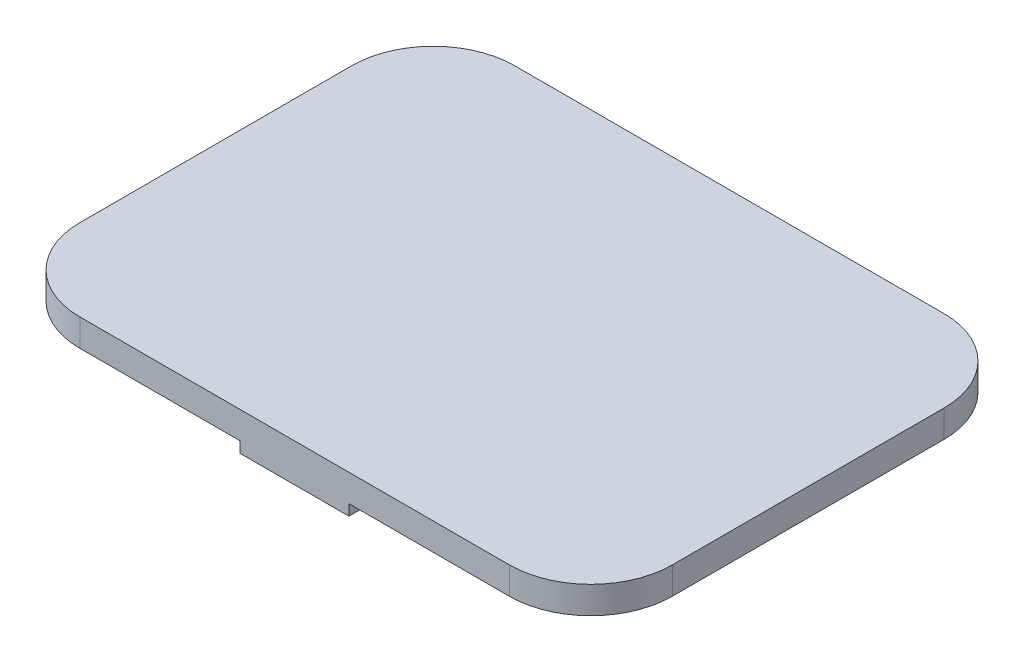
ISO-10303-21;
HEADER;
FILE_DESCRIPTION(('STEP AP214'),'2;1');
FILE_NAME('part.step','',(''),(''),'','','');
FILE_SCHEMA(('AUTOMOTIVE_DESIGN { 1 0 10303 214 1 1 1 1 }'));
ENDSEC;
DATA;
#1=APPLICATION_CONTEXT('core data for automotive mechanical design processes');
#2=APPLICATION_PROTOCOL_DEFINITION('international standard','automotive_design',2000,#1);
#3=PRODUCT_CONTEXT('',#1,'mechanical');
#4=PRODUCT('Part','Part','',(#3));
#5=PRODUCT_RELATED_PRODUCT_CATEGORY('part','',(#4));
#6=PRODUCT_DEFINITION_FORMATION('','',#4);
#7=PRODUCT_DEFINITION_CONTEXT('part definition',#1,'design');
#8=PRODUCT_DEFINITION('design','',#6,#7);
#9=PRODUCT_DEFINITION_SHAPE('','',#8);
#10=(LENGTH_UNIT() NAMED_UNIT(*) SI_UNIT(.MILLI.,.METRE.));
#11=(NAMED_UNIT(*) PLANE_ANGLE_UNIT() SI_UNIT($,.RADIAN.));
#12=(NAMED_UNIT(*) SI_UNIT($,.STERADIAN.) SOLID_ANGLE_UNIT());
#13=UNCERTAINTY_MEASURE_WITH_UNIT(LENGTH_MEASURE(1.E-05),#10,'distance_accuracy_value','');
#14=(GEOMETRIC_REPRESENTATION_CONTEXT(3) GLOBAL_UNCERTAINTY_ASSIGNED_CONTEXT((#13)) GLOBAL_UNIT_ASSIGNED_CONTEXT((#10,
#11,#12)) REPRESENTATION_CONTEXT('',''));
#15=CARTESIAN_POINT('',(0.,0.,0.));
#16=DIRECTION('',(0.,0.,1.));
#17=DIRECTION('',(1.,0.,0.));
#18=AXIS2_PLACEMENT_3D('',#15,#16,#17);
#19=CARTESIAN_POINT('',(0.,0.,0.));
#20=DIRECTION('',(0.,1.,0.));
#21=DIRECTION('',(0.,0.,1.));
#22=AXIS2_PLACEMENT_3D('',#19,#20,#21);
#23=PLANE('',#22);
#24=DIRECTION('',(0.,0.,1.));
#25=VECTOR('',#24,1.);
#26=CARTESIAN_POINT('',(-10.,0.,0.));
#27=LINE('',#26,#25);
#28=CARTESIAN_POINT('',(-10.,0.,-40.));
#29=VERTEX_POINT('',#28);
#30=CARTESIAN_POINT('',(-10.,0.,-37.5));
#31=VERTEX_POINT('',#30);
#32=EDGE_CURVE('E244',#29,#31,#27,.T.);
#33=ORIENTED_EDGE('',*,*,#32,.T.);
#34=DIRECTION('',(1.,0.,0.));
#35=VECTOR('',#34,1.);
#36=CARTESIAN_POINT('',(-10.,0.,-37.5));
#37=LINE('',#36,#35);
#38=CARTESIAN_POINT('',(10.,0.,-37.5));
#39=VERTEX_POINT('',#38);
#40=EDGE_CURVE('E251',#31,#39,#37,.T.);
#41=ORIENTED_EDGE('',*,*,#40,.T.);
#42=DIRECTION('',(0.,0.,1.));
#43=VECTOR('',#42,1.);
#44=CARTESIAN_POINT('',(10.,0.,0.));
#45=LINE('',#44,#43);
#46=CARTESIAN_POINT('',(10.,0.,-40.));
#47=VERTEX_POINT('',#46);
#48=EDGE_CURVE('E234',#47,#39,#45,.T.);
#49=ORIENTED_EDGE('',*,*,#48,.F.);
#50=DIRECTION('',(1.,0.,0.));
#51=VECTOR('',#50,1.);
#52=CARTESIAN_POINT('',(0.,0.,-40.));
#53=LINE('',#52,#51);
#54=CARTESIAN_POINT('',(39.4999999999999,0.,-40.));
#55=VERTEX_POINT('',#54);
#56=EDGE_CURVE('E284',#47,#55,#53,.T.);
#57=ORIENTED_EDGE('',*,*,#56,.T.);
#58=CARTESIAN_POINT('',(39.5,0.,-25.));
#59=DIRECTION('',(0.,1.,0.));
#60=DIRECTION('',(0.,0.,1.));
#61=AXIS2_PLACEMENT_3D('',#58,#59,#60);
#62=CIRCLE('',#61,15.);
#63=CARTESIAN_POINT('',(54.5,0.,-24.9999999999998));
#64=VERTEX_POINT('',#63);
#65=EDGE_CURVE('E294',#55,#64,#62,.F.);
#66=ORIENTED_EDGE('',*,*,#65,.T.);
#67=DIRECTION('',(0.,0.,1.));
#68=VECTOR('',#67,1.);
#69=CARTESIAN_POINT('',(54.5,0.,0.));
#70=LINE('',#69,#68);
#71=CARTESIAN_POINT('',(54.5,0.,25.));
#72=VERTEX_POINT('',#71);
#73=EDGE_CURVE('E334',#64,#72,#70,.T.);
#74=ORIENTED_EDGE('',*,*,#73,.T.);
#75=CARTESIAN_POINT('',(39.5,0.,25.));
#76=DIRECTION('',(0.,1.,0.));
#77=DIRECTION('',(0.,0.,1.));
#78=AXIS2_PLACEMENT_3D('',#75,#76,#77);
#79=CIRCLE('',#78,15.);
#80=CARTESIAN_POINT('',(39.4999999999998,0.,40.));
#81=VERTEX_POINT('',#80);
#82=EDGE_CURVE('E331',#81,#72,#79,.T.);
#83=ORIENTED_EDGE('',*,*,#82,.F.);
#84=DIRECTION('',(1.,0.,0.));
#85=VECTOR('',#84,1.);
#86=CARTESIAN_POINT('',(0.,0.,40.));
#87=LINE('',#86,#85);
#88=CARTESIAN_POINT('',(10.,0.,40.));
#89=VERTEX_POINT('',#88);
#90=EDGE_CURVE('E327',#89,#81,#87,.T.);
#91=ORIENTED_EDGE('',*,*,#90,.F.);
#92=DIRECTION('',(0.,0.,-1.));
#93=VECTOR('',#92,1.);
#94=CARTESIAN_POINT('',(10.,0.,0.));
#95=LINE('',#94,#93);
#96=CARTESIAN_POINT('',(10.,0.,37.5));
#97=VERTEX_POINT('',#96);
#98=EDGE_CURVE('E110',#89,#97,#95,.T.);
#99=ORIENTED_EDGE('',*,*,#98,.T.);
#100=DIRECTION('',(1.,0.,0.));
#101=VECTOR('',#100,1.);
#102=CARTESIAN_POINT('',(-10.,0.,37.5));
#103=LINE('',#102,#101);
#104=CARTESIAN_POINT('',(-10.,0.,37.5));
#105=VERTEX_POINT('',#104);
#106=EDGE_CURVE('E287',#105,#97,#103,.T.);
#107=ORIENTED_EDGE('',*,*,#106,.F.);
#108=DIRECTION('',(0.,0.,-1.));
#109=VECTOR('',#108,1.);
#110=CARTESIAN_POINT('',(-10.,0.,0.));
#111=LINE('',#110,#109);
#112=CARTESIAN_POINT('',(-10.,0.,40.));
#113=VERTEX_POINT('',#112);
#114=EDGE_CURVE('E272',#113,#105,#111,.T.);
#115=ORIENTED_EDGE('',*,*,#114,.F.);
#116=CARTESIAN_POINT('',(-39.5,0.,40.));
#117=VERTEX_POINT('',#116);
#118=EDGE_CURVE('E328',#117,#113,#87,.T.);
#119=ORIENTED_EDGE('',*,*,#118,.F.);
#120=CARTESIAN_POINT('',(-39.5,0.,25.));
#121=DIRECTION('',(0.,1.,0.));
#122=DIRECTION('',(0.,0.,1.));
#123=AXIS2_PLACEMENT_3D('',#120,#121,#122);
#124=CIRCLE('',#123,15.);
#125=CARTESIAN_POINT('',(-54.5,0.,24.9999999999998));
#126=VERTEX_POINT('',#125);
#127=EDGE_CURVE('E324',#126,#117,#124,.T.);
#128=ORIENTED_EDGE('',*,*,#127,.F.);
#129=DIRECTION('',(0.,0.,1.));
#130=VECTOR('',#129,1.);
#131=CARTESIAN_POINT('',(-54.5,0.,0.));
#132=LINE('',#131,#130);
#133=CARTESIAN_POINT('',(-54.5,0.,-25.));
#134=VERTEX_POINT('',#133);
#135=EDGE_CURVE('E321',#134,#126,#132,.T.);
#136=ORIENTED_EDGE('',*,*,#135,.F.);
#137=CARTESIAN_POINT('',(-39.5,0.,-25.));
#138=DIRECTION('',(0.,1.,0.));
#139=DIRECTION('',(0.,0.,1.));
#140=AXIS2_PLACEMENT_3D('',#137,#138,#139);
#141=CIRCLE('',#140,15.);
#142=CARTESIAN_POINT('',(-39.5,0.,-40.));
#143=VERTEX_POINT('',#142);
#144=EDGE_CURVE('E318',#143,#134,#141,.T.);
#145=ORIENTED_EDGE('',*,*,#144,.F.);
#146=EDGE_CURVE('E315',#143,#29,#53,.T.);
#147=ORIENTED_EDGE('',*,*,#146,.T.);
#148=EDGE_LOOP('',(#33,#41,#49,#57,#66,#74,#83,#91,#99,#107,#115,#119,#128,#136,#145,#147));
#149=FACE_BOUND('',#148,.T.);
#150=ADVANCED_FACE('F87',(#149),#23,.F.);
#151=CARTESIAN_POINT('',(-39.5,5.,-25.));
#152=DIRECTION('',(0.,-1.,0.));
#153=DIRECTION('',(0.,0.,-1.));
#154=AXIS2_PLACEMENT_3D('',#151,#152,#153);
#155=CYLINDRICAL_SURFACE('',#154,15.);
#156=ORIENTED_EDGE('',*,*,#144,.T.);
#157=DIRECTION('',(0.,-1.,0.));
#158=VECTOR('',#157,1.);
#159=CARTESIAN_POINT('',(-54.5,5.,-25.));
#160=LINE('',#159,#158);
#161=CARTESIAN_POINT('',(-54.5,5.,-25.));
#162=VERTEX_POINT('',#161);
#163=EDGE_CURVE('E95',#162,#134,#160,.T.);
#164=ORIENTED_EDGE('',*,*,#163,.F.);
#165=CARTESIAN_POINT('',(-39.5,5.,-25.));
#166=DIRECTION('',(0.,1.,0.));
#167=DIRECTION('',(0.,0.,1.));
#168=AXIS2_PLACEMENT_3D('',#165,#166,#167);
#169=CIRCLE('',#168,15.);
#170=CARTESIAN_POINT('',(-39.5,5.,-40.));
#171=VERTEX_POINT('',#170);
#172=EDGE_CURVE('E293',#171,#162,#169,.T.);
#173=ORIENTED_EDGE('',*,*,#172,.F.);
#174=DIRECTION('',(0.,-1.,0.));
#175=VECTOR('',#174,1.);
#176=CARTESIAN_POINT('',(-39.5,5.,-40.));
#177=LINE('',#176,#175);
#178=EDGE_CURVE('E12',#171,#143,#177,.T.);
#179=ORIENTED_EDGE('',*,*,#178,.T.);
#180=EDGE_LOOP('',(#156,#164,#173,#179));
#181=FACE_BOUND('',#180,.T.);
#182=ADVANCED_FACE('F361',(#181),#155,.T.);
#183=CARTESIAN_POINT('',(-54.5,5.,0.));
#184=DIRECTION('',(1.,0.,0.));
#185=DIRECTION('',(0.,0.,-1.));
#186=AXIS2_PLACEMENT_3D('',#183,#184,#185);
#187=PLANE('',#186);
#188=ORIENTED_EDGE('',*,*,#135,.T.);
#189=DIRECTION('',(0.,-1.,0.));
#190=VECTOR('',#189,1.);
#191=CARTESIAN_POINT('',(-54.5,5.,24.9999999999998));
#192=LINE('',#191,#190);
#193=CARTESIAN_POINT('',(-54.5,5.,24.9999999999998));
#194=VERTEX_POINT('',#193);
#195=EDGE_CURVE('E351',#194,#126,#192,.T.);
#196=ORIENTED_EDGE('',*,*,#195,.F.);
#197=DIRECTION('',(0.,0.,1.));
#198=VECTOR('',#197,1.);
#199=CARTESIAN_POINT('',(-54.5,5.,0.));
#200=LINE('',#199,#198);
#201=EDGE_CURVE('E297',#162,#194,#200,.T.);
#202=ORIENTED_EDGE('',*,*,#201,.F.);
#203=ORIENTED_EDGE('',*,*,#163,.T.);
#204=EDGE_LOOP('',(#188,#196,#202,#203));
#205=FACE_BOUND('',#204,.T.);
#206=ADVANCED_FACE('F356',(#205),#187,.F.);
#207=CARTESIAN_POINT('',(-39.5,5.,25.));
#208=DIRECTION('',(0.,-1.,0.));
#209=DIRECTION('',(0.,0.,-1.));
#210=AXIS2_PLACEMENT_3D('',#207,#208,#209);
#211=CYLINDRICAL_SURFACE('',#210,15.);
#212=ORIENTED_EDGE('',*,*,#127,.T.);
#213=DIRECTION('',(0.,-1.,0.));
#214=VECTOR('',#213,1.);
#215=CARTESIAN_POINT('',(-39.5,5.,40.));
#216=LINE('',#215,#214);
#217=CARTESIAN_POINT('',(-39.5,5.,40.));
#218=VERTEX_POINT('',#217);
#219=EDGE_CURVE('E348',#218,#117,#216,.T.);
#220=ORIENTED_EDGE('',*,*,#219,.F.);
#221=CARTESIAN_POINT('',(-39.5,5.,25.));
#222=DIRECTION('',(0.,1.,0.));
#223=DIRECTION('',(0.,0.,1.));
#224=AXIS2_PLACEMENT_3D('',#221,#222,#223);
#225=CIRCLE('',#224,15.);
#226=EDGE_CURVE('E300',#194,#218,#225,.T.);
#227=ORIENTED_EDGE('',*,*,#226,.F.);
#228=ORIENTED_EDGE('',*,*,#195,.T.);
#229=EDGE_LOOP('',(#212,#220,#227,#228));
#230=FACE_BOUND('',#229,.T.);
#231=ADVANCED_FACE('F408',(#230),#211,.T.);
#232=CARTESIAN_POINT('',(0.,5.,40.));
#233=DIRECTION('',(0.,0.,-1.));
#234=DIRECTION('',(-1.,0.,0.));
#235=AXIS2_PLACEMENT_3D('',#232,#233,#234);
#236=PLANE('',#235);
#237=ORIENTED_EDGE('',*,*,#118,.T.);
#238=DIRECTION('',(0.,-1.,0.));
#239=VECTOR('',#238,1.);
#240=CARTESIAN_POINT('',(-10.,0.,40.));
#241=LINE('',#240,#239);
#242=CARTESIAN_POINT('',(-10.,-2.,40.));
#243=VERTEX_POINT('',#242);
#244=EDGE_CURVE('E275',#113,#243,#241,.T.);
#245=ORIENTED_EDGE('',*,*,#244,.T.);
#246=DIRECTION('',(1.,0.,0.));
#247=VECTOR('',#246,1.);
#248=CARTESIAN_POINT('',(-10.,-2.,40.));
#249=LINE('',#248,#247);
#250=CARTESIAN_POINT('',(10.,-2.,40.));
#251=VERTEX_POINT('',#250);
#252=EDGE_CURVE('E285',#243,#251,#249,.T.);
#253=ORIENTED_EDGE('',*,*,#252,.T.);
#254=DIRECTION('',(0.,-1.,0.));
#255=VECTOR('',#254,1.);
#256=CARTESIAN_POINT('',(10.,0.,40.));
#257=LINE('',#256,#255);
#258=EDGE_CURVE('E261',#89,#251,#257,.T.);
#259=ORIENTED_EDGE('',*,*,#258,.F.);
#260=ORIENTED_EDGE('',*,*,#90,.T.);
#261=DIRECTION('',(0.,-1.,0.));
#262=VECTOR('',#261,1.);
#263=CARTESIAN_POINT('',(39.4999999999998,5.,40.));
#264=LINE('',#263,#262);
#265=CARTESIAN_POINT('',(39.4999999999998,5.,40.));
#266=VERTEX_POINT('',#265);
#267=EDGE_CURVE('E345',#266,#81,#264,.T.);
#268=ORIENTED_EDGE('',*,*,#267,.F.);
#269=DIRECTION('',(1.,0.,0.));
#270=VECTOR('',#269,1.);
#271=CARTESIAN_POINT('',(0.,5.,40.));
#272=LINE('',#271,#270);
#273=EDGE_CURVE('E303',#218,#266,#272,.T.);
#274=ORIENTED_EDGE('',*,*,#273,.F.);
#275=ORIENTED_EDGE('',*,*,#219,.T.);
#276=EDGE_LOOP('',(#237,#245,#253,#259,#260,#268,#274,#275));
#277=FACE_BOUND('',#276,.T.);
#278=ADVANCED_FACE('F404',(#277),#236,.F.);
#279=CARTESIAN_POINT('',(39.5,5.,25.));
#280=DIRECTION('',(0.,-1.,0.));
#281=DIRECTION('',(0.,0.,-1.));
#282=AXIS2_PLACEMENT_3D('',#279,#280,#281);
#283=CYLINDRICAL_SURFACE('',#282,15.);
#284=ORIENTED_EDGE('',*,*,#82,.T.);
#285=DIRECTION('',(0.,-1.,0.));
#286=VECTOR('',#285,1.);
#287=CARTESIAN_POINT('',(54.5,5.,25.));
#288=LINE('',#287,#286);
#289=CARTESIAN_POINT('',(54.5,5.,25.));
#290=VERTEX_POINT('',#289);
#291=EDGE_CURVE('E343',#290,#72,#288,.T.);
#292=ORIENTED_EDGE('',*,*,#291,.F.);
#293=CARTESIAN_POINT('',(39.5,5.,25.));
#294=DIRECTION('',(0.,1.,0.));
#295=DIRECTION('',(0.,0.,1.));
#296=AXIS2_PLACEMENT_3D('',#293,#294,#295);
#297=CIRCLE('',#296,15.);
#298=EDGE_CURVE('E306',#266,#290,#297,.T.);
#299=ORIENTED_EDGE('',*,*,#298,.F.);
#300=ORIENTED_EDGE('',*,*,#267,.T.);
#301=EDGE_LOOP('',(#284,#292,#299,#300));
#302=FACE_BOUND('',#301,.T.);
#303=ADVANCED_FACE('F400',(#302),#283,.T.);
#304=CARTESIAN_POINT('',(54.5,5.,0.));
#305=DIRECTION('',(1.,0.,0.));
#306=DIRECTION('',(0.,0.,-1.));
#307=AXIS2_PLACEMENT_3D('',#304,#305,#306);
#308=PLANE('',#307);
#309=ORIENTED_EDGE('',*,*,#73,.F.);
#310=DIRECTION('',(0.,-1.,0.));
#311=VECTOR('',#310,1.);
#312=CARTESIAN_POINT('',(54.5,5.,-24.9999999999998));
#313=LINE('',#312,#311);
#314=CARTESIAN_POINT('',(54.5,5.,-24.9999999999998));
#315=VERTEX_POINT('',#314);
#316=EDGE_CURVE('E341',#315,#64,#313,.T.);
#317=ORIENTED_EDGE('',*,*,#316,.F.);
#318=DIRECTION('',(0.,0.,1.));
#319=VECTOR('',#318,1.);
#320=CARTESIAN_POINT('',(54.5,5.,0.));
#321=LINE('',#320,#319);
#322=EDGE_CURVE('E308',#315,#290,#321,.T.);
#323=ORIENTED_EDGE('',*,*,#322,.T.);
#324=ORIENTED_EDGE('',*,*,#291,.T.);
#325=EDGE_LOOP('',(#309,#317,#323,#324));
#326=FACE_BOUND('',#325,.T.);
#327=ADVANCED_FACE('F396',(#326),#308,.T.);
#328=CARTESIAN_POINT('',(39.5,5.,-25.));
#329=DIRECTION('',(0.,-1.,0.));
#330=DIRECTION('',(0.,0.,-1.));
#331=AXIS2_PLACEMENT_3D('',#328,#329,#330);
#332=CYLINDRICAL_SURFACE('',#331,15.);
#333=ORIENTED_EDGE('',*,*,#65,.F.);
#334=DIRECTION('',(0.,-1.,0.));
#335=VECTOR('',#334,1.);
#336=CARTESIAN_POINT('',(39.4999999999999,5.,-40.));
#337=LINE('',#336,#335);
#338=CARTESIAN_POINT('',(39.4999999999999,5.,-40.));
#339=VERTEX_POINT('',#338);
#340=EDGE_CURVE('E314',#339,#55,#337,.T.);
#341=ORIENTED_EDGE('',*,*,#340,.F.);
#342=CARTESIAN_POINT('',(39.5,5.,-25.));
#343=DIRECTION('',(0.,1.,0.));
#344=DIRECTION('',(0.,0.,1.));
#345=AXIS2_PLACEMENT_3D('',#342,#343,#344);
#346=CIRCLE('',#345,15.);
#347=EDGE_CURVE('E311',#339,#315,#346,.F.);
#348=ORIENTED_EDGE('',*,*,#347,.T.);
#349=ORIENTED_EDGE('',*,*,#316,.T.);
#350=EDGE_LOOP('',(#333,#341,#348,#349));
#351=FACE_BOUND('',#350,.T.);
#352=ADVANCED_FACE('F393',(#351),#332,.T.);
#353=CARTESIAN_POINT('',(0.,5.,-40.));
#354=DIRECTION('',(0.,0.,-1.));
#355=DIRECTION('',(-1.,0.,0.));
#356=AXIS2_PLACEMENT_3D('',#353,#354,#355);
#357=PLANE('',#356);
#358=ORIENTED_EDGE('',*,*,#146,.F.);
#359=ORIENTED_EDGE('',*,*,#178,.F.);
#360=DIRECTION('',(1.,0.,0.));
#361=VECTOR('',#360,1.);
#362=CARTESIAN_POINT('',(0.,5.,-40.));
#363=LINE('',#362,#361);
#364=EDGE_CURVE('E290',#171,#339,#363,.T.);
#365=ORIENTED_EDGE('',*,*,#364,.T.);
#366=ORIENTED_EDGE('',*,*,#340,.T.);
#367=ORIENTED_EDGE('',*,*,#56,.F.);
#368=DIRECTION('',(0.,-1.,0.));
#369=VECTOR('',#368,1.);
#370=CARTESIAN_POINT('',(10.,0.,-40.));
#371=LINE('',#370,#369);
#372=CARTESIAN_POINT('',(10.,-2.,-40.));
#373=VERTEX_POINT('',#372);
#374=EDGE_CURVE('E102',#47,#373,#371,.T.);
#375=ORIENTED_EDGE('',*,*,#374,.T.);
#376=DIRECTION('',(1.,0.,0.));
#377=VECTOR('',#376,1.);
#378=CARTESIAN_POINT('',(-10.,-2.,-40.));
#379=LINE('',#378,#377);
#380=CARTESIAN_POINT('',(-10.,-2.,-40.));
#381=VERTEX_POINT('',#380);
#382=EDGE_CURVE('E223',#381,#373,#379,.T.);
#383=ORIENTED_EDGE('',*,*,#382,.F.);
#384=DIRECTION('',(0.,-1.,0.));
#385=VECTOR('',#384,1.);
#386=CARTESIAN_POINT('',(-10.,0.,-40.));
#387=LINE('',#386,#385);
#388=EDGE_CURVE('E242',#29,#381,#387,.T.);
#389=ORIENTED_EDGE('',*,*,#388,.F.);
#390=EDGE_LOOP('',(#358,#359,#365,#366,#367,#375,#383,#389));
#391=FACE_BOUND('',#390,.T.);
#392=ADVANCED_FACE('F89',(#391),#357,.T.);
#393=CARTESIAN_POINT('',(0.,5.,0.));
#394=DIRECTION('',(0.,1.,0.));
#395=DIRECTION('',(0.,0.,1.));
#396=AXIS2_PLACEMENT_3D('',#393,#394,#395);
#397=PLANE('',#396);
#398=ORIENTED_EDGE('',*,*,#364,.F.);
#399=ORIENTED_EDGE('',*,*,#172,.T.);
#400=ORIENTED_EDGE('',*,*,#201,.T.);
#401=ORIENTED_EDGE('',*,*,#226,.T.);
#402=ORIENTED_EDGE('',*,*,#273,.T.);
#403=ORIENTED_EDGE('',*,*,#298,.T.);
#404=ORIENTED_EDGE('',*,*,#322,.F.);
#405=ORIENTED_EDGE('',*,*,#347,.F.);
#406=EDGE_LOOP('',(#398,#399,#400,#401,#402,#403,#404,#405));
#407=FACE_BOUND('',#406,.T.);
#408=ADVANCED_FACE('F391',(#407),#397,.T.);
#409=CARTESIAN_POINT('',(-10.,17.75,17.7500000000004));
#410=DIRECTION('',(0.,0.70710678118654,0.707106781186555));
#411=DIRECTION('',(0.,-0.707106781186555,0.70710678118654));
#412=AXIS2_PLACEMENT_3D('',#409,#410,#411);
#413=PLANE('',#412);
#414=DIRECTION('',(1.,0.,0.));
#415=VECTOR('',#414,1.);
#416=CARTESIAN_POINT('',(-10.,-0.999999999999994,36.5));
#417=LINE('',#416,#415);
#418=CARTESIAN_POINT('',(-10.,-0.999999999999994,36.5));
#419=VERTEX_POINT('',#418);
#420=CARTESIAN_POINT('',(10.,-0.999999999999994,36.5));
#421=VERTEX_POINT('',#420);
#422=EDGE_CURVE('E281',#419,#421,#417,.T.);
#423=ORIENTED_EDGE('',*,*,#422,.T.);
#424=DIRECTION('',(0.,-0.707106781186555,0.70710678118654));
#425=VECTOR('',#424,1.);
#426=CARTESIAN_POINT('',(10.,17.75,17.7500000000004));
#427=LINE('',#426,#425);
#428=CARTESIAN_POINT('',(10.,-2.,37.5));
#429=VERTEX_POINT('',#428);
#430=EDGE_CURVE('E250',#421,#429,#427,.T.);
#431=ORIENTED_EDGE('',*,*,#430,.T.);
#432=DIRECTION('',(1.,0.,0.));
#433=VECTOR('',#432,1.);
#434=CARTESIAN_POINT('',(-10.,-2.,37.5));
#435=LINE('',#434,#433);
#436=CARTESIAN_POINT('',(-10.,-2.,37.5));
#437=VERTEX_POINT('',#436);
#438=EDGE_CURVE('E282',#437,#429,#435,.T.);
#439=ORIENTED_EDGE('',*,*,#438,.F.);
#440=DIRECTION('',(0.,-0.707106781186555,0.70710678118654));
#441=VECTOR('',#440,1.);
#442=CARTESIAN_POINT('',(-10.,17.75,17.7500000000004));
#443=LINE('',#442,#441);
#444=EDGE_CURVE('E267',#419,#437,#443,.T.);
#445=ORIENTED_EDGE('',*,*,#444,.F.);
#446=EDGE_LOOP('',(#423,#431,#439,#445));
#447=FACE_BOUND('',#446,.T.);
#448=ADVANCED_FACE('F440',(#447),#413,.F.);
#449=CARTESIAN_POINT('',(-10.,-2.,0.));
#450=DIRECTION('',(0.,-1.,0.));
#451=DIRECTION('',(0.,0.,-1.));
#452=AXIS2_PLACEMENT_3D('',#449,#450,#451);
#453=PLANE('',#452);
#454=ORIENTED_EDGE('',*,*,#438,.T.);
#455=DIRECTION('',(0.,0.,-1.));
#456=VECTOR('',#455,1.);
#457=CARTESIAN_POINT('',(10.,-2.,0.));
#458=LINE('',#457,#456);
#459=EDGE_CURVE('E264',#251,#429,#458,.T.);
#460=ORIENTED_EDGE('',*,*,#459,.F.);
#461=ORIENTED_EDGE('',*,*,#252,.F.);
#462=DIRECTION('',(0.,0.,-1.));
#463=VECTOR('',#462,1.);
#464=CARTESIAN_POINT('',(-10.,-2.,0.));
#465=LINE('',#464,#463);
#466=EDGE_CURVE('E278',#243,#437,#465,.T.);
#467=ORIENTED_EDGE('',*,*,#466,.T.);
#468=EDGE_LOOP('',(#454,#460,#461,#467));
#469=FACE_BOUND('',#468,.T.);
#470=ADVANCED_FACE('F463',(#469),#453,.T.);
#471=CARTESIAN_POINT('',(-10.,-18.75,18.7499999999999));
#472=DIRECTION('',(0.,0.70710678118655,-0.707106781186545));
#473=DIRECTION('',(0.,0.707106781186545,0.70710678118655));
#474=AXIS2_PLACEMENT_3D('',#471,#472,#473);
#475=PLANE('',#474);
#476=ORIENTED_EDGE('',*,*,#106,.T.);
#477=DIRECTION('',(0.,0.707106781186545,0.70710678118655));
#478=VECTOR('',#477,1.);
#479=CARTESIAN_POINT('',(10.,-18.75,18.7499999999999));
#480=LINE('',#479,#478);
#481=EDGE_CURVE('E257',#421,#97,#480,.T.);
#482=ORIENTED_EDGE('',*,*,#481,.F.);
#483=ORIENTED_EDGE('',*,*,#422,.F.);
#484=DIRECTION('',(0.,0.707106781186545,0.70710678118655));
#485=VECTOR('',#484,1.);
#486=CARTESIAN_POINT('',(-10.,-18.75,18.7499999999999));
#487=LINE('',#486,#485);
#488=EDGE_CURVE('E269',#419,#105,#487,.T.);
#489=ORIENTED_EDGE('',*,*,#488,.T.);
#490=EDGE_LOOP('',(#476,#482,#483,#489));
#491=FACE_BOUND('',#490,.T.);
#492=ADVANCED_FACE('F470',(#491),#475,.T.);
#493=CARTESIAN_POINT('',(-10.,0.,0.));
#494=DIRECTION('',(1.,0.,0.));
#495=DIRECTION('',(0.,0.,-1.));
#496=AXIS2_PLACEMENT_3D('',#493,#494,#495);
#497=PLANE('',#496);
#498=ORIENTED_EDGE('',*,*,#444,.T.);
#499=ORIENTED_EDGE('',*,*,#466,.F.);
#500=ORIENTED_EDGE('',*,*,#244,.F.);
#501=ORIENTED_EDGE('',*,*,#114,.T.);
#502=ORIENTED_EDGE('',*,*,#488,.F.);
#503=EDGE_LOOP('',(#498,#499,#500,#501,#502));
#504=FACE_BOUND('',#503,.T.);
#505=ADVANCED_FACE('F478',(#504),#497,.F.);
#506=CARTESIAN_POINT('',(10.,0.,0.));
#507=DIRECTION('',(1.,0.,0.));
#508=DIRECTION('',(0.,0.,-1.));
#509=AXIS2_PLACEMENT_3D('',#506,#507,#508);
#510=PLANE('',#509);
#511=ORIENTED_EDGE('',*,*,#430,.F.);
#512=ORIENTED_EDGE('',*,*,#481,.T.);
#513=ORIENTED_EDGE('',*,*,#98,.F.);
#514=ORIENTED_EDGE('',*,*,#258,.T.);
#515=ORIENTED_EDGE('',*,*,#459,.T.);
#516=EDGE_LOOP('',(#511,#512,#513,#514,#515));
#517=FACE_BOUND('',#516,.T.);
#518=ADVANCED_FACE('F379',(#517),#510,.T.);
#519=CARTESIAN_POINT('',(-10.,17.75,-17.7500000000004));
#520=DIRECTION('',(0.,-0.70710678118654,0.707106781186555));
#521=DIRECTION('',(0.,-0.707106781186555,-0.70710678118654));
#522=AXIS2_PLACEMENT_3D('',#519,#520,#521);
#523=PLANE('',#522);
#524=DIRECTION('',(1.,0.,0.));
#525=VECTOR('',#524,1.);
#526=CARTESIAN_POINT('',(-10.,-2.,-37.5));
#527=LINE('',#526,#525);
#528=CARTESIAN_POINT('',(-10.,-2.,-37.5));
#529=VERTEX_POINT('',#528);
#530=CARTESIAN_POINT('',(10.,-2.,-37.5));
#531=VERTEX_POINT('',#530);
#532=EDGE_CURVE('E213',#529,#531,#527,.T.);
#533=ORIENTED_EDGE('',*,*,#532,.T.);
#534=DIRECTION('',(0.,-0.707106781186555,-0.70710678118654));
#535=VECTOR('',#534,1.);
#536=CARTESIAN_POINT('',(10.,17.75,-17.7500000000004));
#537=LINE('',#536,#535);
#538=CARTESIAN_POINT('',(10.,-0.999999999999994,-36.5));
#539=VERTEX_POINT('',#538);
#540=EDGE_CURVE('E216',#539,#531,#537,.T.);
#541=ORIENTED_EDGE('',*,*,#540,.F.);
#542=DIRECTION('',(1.,0.,0.));
#543=VECTOR('',#542,1.);
#544=CARTESIAN_POINT('',(-10.,-0.999999999999994,-36.5));
#545=LINE('',#544,#543);
#546=CARTESIAN_POINT('',(-10.,-0.999999999999994,-36.5));
#547=VERTEX_POINT('',#546);
#548=EDGE_CURVE('E248',#547,#539,#545,.T.);
#549=ORIENTED_EDGE('',*,*,#548,.F.);
#550=DIRECTION('',(0.,-0.707106781186555,-0.70710678118654));
#551=VECTOR('',#550,1.);
#552=CARTESIAN_POINT('',(-10.,17.75,-17.7500000000004));
#553=LINE('',#552,#551);
#554=EDGE_CURVE('E219',#547,#529,#553,.T.);
#555=ORIENTED_EDGE('',*,*,#554,.T.);
#556=EDGE_LOOP('',(#533,#541,#549,#555));
#557=FACE_BOUND('',#556,.T.);
#558=ADVANCED_FACE('F215',(#557),#523,.T.);
#559=CARTESIAN_POINT('',(-10.,-18.75,-18.7499999999999));
#560=DIRECTION('',(0.,-0.70710678118655,-0.707106781186545));
#561=DIRECTION('',(0.,0.707106781186545,-0.70710678118655));
#562=AXIS2_PLACEMENT_3D('',#559,#560,#561);
#563=PLANE('',#562);
#564=ORIENTED_EDGE('',*,*,#548,.T.);
#565=DIRECTION('',(0.,0.707106781186545,-0.70710678118655));
#566=VECTOR('',#565,1.);
#567=CARTESIAN_POINT('',(10.,-18.75,-18.7499999999999));
#568=LINE('',#567,#566);
#569=EDGE_CURVE('E229',#539,#39,#568,.T.);
#570=ORIENTED_EDGE('',*,*,#569,.T.);
#571=ORIENTED_EDGE('',*,*,#40,.F.);
#572=DIRECTION('',(0.,0.707106781186545,-0.70710678118655));
#573=VECTOR('',#572,1.);
#574=CARTESIAN_POINT('',(-10.,-18.75,-18.7499999999999));
#575=LINE('',#574,#573);
#576=EDGE_CURVE('E224',#547,#31,#575,.T.);
#577=ORIENTED_EDGE('',*,*,#576,.F.);
#578=EDGE_LOOP('',(#564,#570,#571,#577));
#579=FACE_BOUND('',#578,.T.);
#580=ADVANCED_FACE('F371',(#579),#563,.F.);
#581=CARTESIAN_POINT('',(-10.,-2.,0.));
#582=DIRECTION('',(0.,1.,0.));
#583=DIRECTION('',(0.,0.,1.));
#584=AXIS2_PLACEMENT_3D('',#581,#582,#583);
#585=PLANE('',#584);
#586=ORIENTED_EDGE('',*,*,#382,.T.);
#587=DIRECTION('',(0.,0.,1.));
#588=VECTOR('',#587,1.);
#589=CARTESIAN_POINT('',(10.,-2.,0.));
#590=LINE('',#589,#588);
#591=EDGE_CURVE('E227',#373,#531,#590,.T.);
#592=ORIENTED_EDGE('',*,*,#591,.T.);
#593=ORIENTED_EDGE('',*,*,#532,.F.);
#594=DIRECTION('',(0.,0.,1.));
#595=VECTOR('',#594,1.);
#596=CARTESIAN_POINT('',(-10.,-2.,0.));
#597=LINE('',#596,#595);
#598=EDGE_CURVE('E240',#381,#529,#597,.T.);
#599=ORIENTED_EDGE('',*,*,#598,.F.);
#600=EDGE_LOOP('',(#586,#592,#593,#599));
#601=FACE_BOUND('',#600,.T.);
#602=ADVANCED_FACE('F231',(#601),#585,.F.);
#603=CARTESIAN_POINT('',(-10.,0.,0.));
#604=DIRECTION('',(1.,0.,0.));
#605=DIRECTION('',(0.,0.,1.));
#606=AXIS2_PLACEMENT_3D('',#603,#604,#605);
#607=PLANE('',#606);
#608=ORIENTED_EDGE('',*,*,#554,.F.);
#609=ORIENTED_EDGE('',*,*,#576,.T.);
#610=ORIENTED_EDGE('',*,*,#32,.F.);
#611=ORIENTED_EDGE('',*,*,#388,.T.);
#612=ORIENTED_EDGE('',*,*,#598,.T.);
#613=EDGE_LOOP('',(#608,#609,#610,#611,#612));
#614=FACE_BOUND('',#613,.T.);
#615=ADVANCED_FACE('F366',(#614),#607,.F.);
#616=CARTESIAN_POINT('',(10.,0.,0.));
#617=DIRECTION('',(1.,0.,0.));
#618=DIRECTION('',(0.,0.,1.));
#619=AXIS2_PLACEMENT_3D('',#616,#617,#618);
#620=PLANE('',#619);
#621=ORIENTED_EDGE('',*,*,#540,.T.);
#622=ORIENTED_EDGE('',*,*,#591,.F.);
#623=ORIENTED_EDGE('',*,*,#374,.F.);
#624=ORIENTED_EDGE('',*,*,#48,.T.);
#625=ORIENTED_EDGE('',*,*,#569,.F.);
#626=EDGE_LOOP('',(#621,#622,#623,#624,#625));
#627=FACE_BOUND('',#626,.T.);
#628=ADVANCED_FACE('F226',(#627),#620,.T.);
#629=CLOSED_SHELL('',(#150,#182,#206,#231,#278,#303,#327,#352,#392,#408,#448,#470,#492,#505,
#518,#558,#580,#602,#615,#628));
#630=MANIFOLD_SOLID_BREP('B2',#629);
#631=ADVANCED_BREP_SHAPE_REPRESENTATION('',(#18,#630),#14);
#632=SHAPE_DEFINITION_REPRESENTATION(#9,#631);
ENDSEC;
END-ISO-10303-21;
